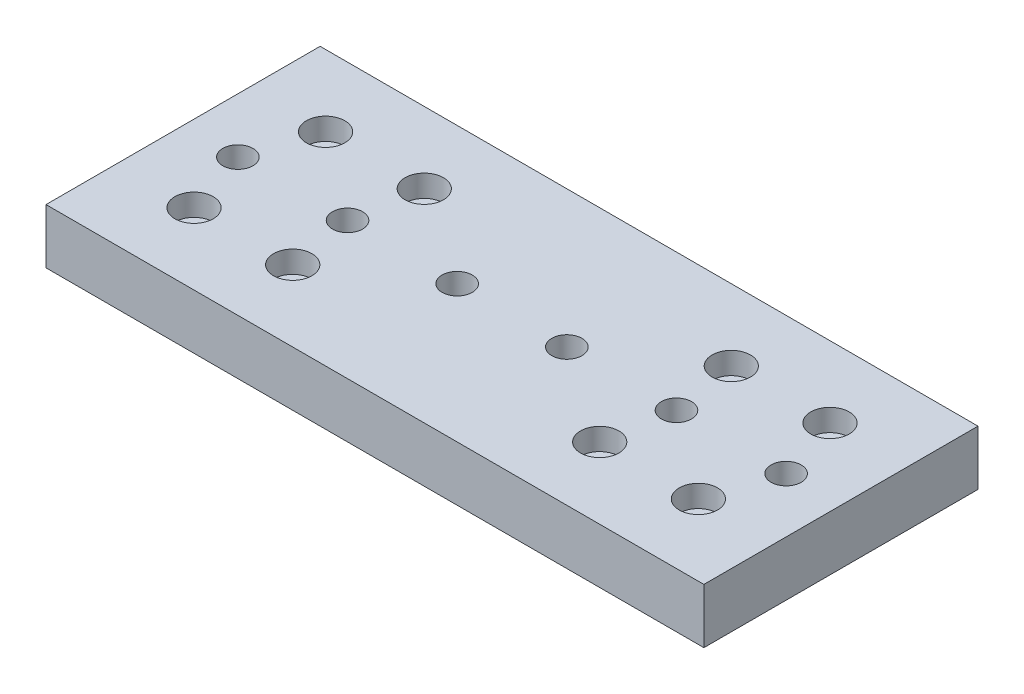
ISO-10303-21;
HEADER;
FILE_DESCRIPTION(('STEP AP214'),'2;1');
FILE_NAME('part.step','',(''),(''),'','','');
FILE_SCHEMA(('AUTOMOTIVE_DESIGN { 1 0 10303 214 1 1 1 1 }'));
ENDSEC;
DATA;
#1=APPLICATION_CONTEXT('core data for automotive mechanical design processes');
#2=APPLICATION_PROTOCOL_DEFINITION('international standard','automotive_design',2000,#1);
#3=PRODUCT_CONTEXT('',#1,'mechanical');
#4=PRODUCT('Part','Part','',(#3));
#5=PRODUCT_RELATED_PRODUCT_CATEGORY('part','',(#4));
#6=PRODUCT_DEFINITION_FORMATION('','',#4);
#7=PRODUCT_DEFINITION_CONTEXT('part definition',#1,'design');
#8=PRODUCT_DEFINITION('design','',#6,#7);
#9=PRODUCT_DEFINITION_SHAPE('','',#8);
#10=(LENGTH_UNIT() NAMED_UNIT(*) SI_UNIT(.MILLI.,.METRE.));
#11=(NAMED_UNIT(*) PLANE_ANGLE_UNIT() SI_UNIT($,.RADIAN.));
#12=(NAMED_UNIT(*) SI_UNIT($,.STERADIAN.) SOLID_ANGLE_UNIT());
#13=UNCERTAINTY_MEASURE_WITH_UNIT(LENGTH_MEASURE(1.E-05),#10,'distance_accuracy_value','');
#14=(GEOMETRIC_REPRESENTATION_CONTEXT(3) GLOBAL_UNCERTAINTY_ASSIGNED_CONTEXT((#13)) GLOBAL_UNIT_ASSIGNED_CONTEXT((#10,
#11,#12)) REPRESENTATION_CONTEXT('',''));
#15=CARTESIAN_POINT('',(0.,0.,0.));
#16=DIRECTION('',(0.,0.,1.));
#17=DIRECTION('',(1.,0.,0.));
#18=AXIS2_PLACEMENT_3D('',#15,#16,#17);
#19=CARTESIAN_POINT('',(0.,0.,0.));
#20=DIRECTION('',(0.,1.,0.));
#21=DIRECTION('',(0.,0.,1.));
#22=AXIS2_PLACEMENT_3D('',#19,#20,#21);
#23=PLANE('',#22);
#24=CARTESIAN_POINT('',(50.,0.,0.));
#25=DIRECTION('',(0.,-1.,0.));
#26=DIRECTION('',(0.,0.,-1.));
#27=AXIS2_PLACEMENT_3D('',#24,#25,#26);
#28=CIRCLE('',#27,5.735);
#29=CARTESIAN_POINT('',(50.,0.,-5.735));
#30=VERTEX_POINT('',#29);
#31=EDGE_CURVE('E471',#30,#30,#28,.T.);
#32=ORIENTED_EDGE('',*,*,#31,.F.);
#33=EDGE_LOOP('',(#32));
#34=FACE_BOUND('',#33,.T.);
#35=CARTESIAN_POINT('',(30.,0.,0.));
#36=DIRECTION('',(0.,-1.,0.));
#37=DIRECTION('',(0.,0.,-1.));
#38=AXIS2_PLACEMENT_3D('',#35,#36,#37);
#39=CIRCLE('',#38,5.735);
#40=CARTESIAN_POINT('',(30.,0.,-5.735));
#41=VERTEX_POINT('',#40);
#42=EDGE_CURVE('E478',#41,#41,#39,.T.);
#43=ORIENTED_EDGE('',*,*,#42,.F.);
#44=EDGE_LOOP('',(#43));
#45=FACE_BOUND('',#44,.T.);
#46=CARTESIAN_POINT('',(9.99999999999999,0.,0.));
#47=DIRECTION('',(0.,-1.,0.));
#48=DIRECTION('',(0.,0.,-1.));
#49=AXIS2_PLACEMENT_3D('',#46,#47,#48);
#50=CIRCLE('',#49,5.735);
#51=CARTESIAN_POINT('',(9.99999999999999,0.,-5.735));
#52=VERTEX_POINT('',#51);
#53=EDGE_CURVE('E487',#52,#52,#50,.T.);
#54=ORIENTED_EDGE('',*,*,#53,.F.);
#55=EDGE_LOOP('',(#54));
#56=FACE_BOUND('',#55,.T.);
#57=CARTESIAN_POINT('',(-10.,0.,0.));
#58=DIRECTION('',(0.,-1.,0.));
#59=DIRECTION('',(0.,0.,-1.));
#60=AXIS2_PLACEMENT_3D('',#57,#58,#59);
#61=CIRCLE('',#60,5.735);
#62=CARTESIAN_POINT('',(-10.,0.,-5.735));
#63=VERTEX_POINT('',#62);
#64=EDGE_CURVE('E496',#63,#63,#61,.T.);
#65=ORIENTED_EDGE('',*,*,#64,.F.);
#66=EDGE_LOOP('',(#65));
#67=FACE_BOUND('',#66,.T.);
#68=CARTESIAN_POINT('',(-30.,0.,0.));
#69=DIRECTION('',(0.,-1.,0.));
#70=DIRECTION('',(0.,0.,-1.));
#71=AXIS2_PLACEMENT_3D('',#68,#69,#70);
#72=CIRCLE('',#71,5.735);
#73=CARTESIAN_POINT('',(-30.,0.,-5.735));
#74=VERTEX_POINT('',#73);
#75=EDGE_CURVE('E505',#74,#74,#72,.T.);
#76=ORIENTED_EDGE('',*,*,#75,.F.);
#77=EDGE_LOOP('',(#76));
#78=FACE_BOUND('',#77,.T.);
#79=DIRECTION('',(0.,0.,1.));
#80=VECTOR('',#79,1.);
#81=CARTESIAN_POINT('',(-60.,0.,25.));
#82=LINE('',#81,#80);
#83=CARTESIAN_POINT('',(-60.,0.,-25.));
#84=VERTEX_POINT('',#83);
#85=CARTESIAN_POINT('',(-60.,0.,25.));
#86=VERTEX_POINT('',#85);
#87=EDGE_CURVE('E105',#84,#86,#82,.T.);
#88=ORIENTED_EDGE('',*,*,#87,.F.);
#89=DIRECTION('',(-1.,0.,0.));
#90=VECTOR('',#89,1.);
#91=CARTESIAN_POINT('',(60.,0.,-25.));
#92=LINE('',#91,#90);
#93=CARTESIAN_POINT('',(60.,0.,-25.));
#94=VERTEX_POINT('',#93);
#95=EDGE_CURVE('E80',#94,#84,#92,.T.);
#96=ORIENTED_EDGE('',*,*,#95,.F.);
#97=DIRECTION('',(0.,0.,-1.));
#98=VECTOR('',#97,1.);
#99=CARTESIAN_POINT('',(60.,0.,25.));
#100=LINE('',#99,#98);
#101=CARTESIAN_POINT('',(60.,0.,25.));
#102=VERTEX_POINT('',#101);
#103=EDGE_CURVE('E74',#102,#94,#100,.T.);
#104=ORIENTED_EDGE('',*,*,#103,.F.);
#105=DIRECTION('',(1.,0.,0.));
#106=VECTOR('',#105,1.);
#107=CARTESIAN_POINT('',(60.,0.,25.));
#108=LINE('',#107,#106);
#109=EDGE_CURVE('E96',#86,#102,#108,.T.);
#110=ORIENTED_EDGE('',*,*,#109,.F.);
#111=EDGE_LOOP('',(#88,#96,#104,#110));
#112=FACE_BOUND('',#111,.T.);
#113=CARTESIAN_POINT('',(-27.9999999999994,0.,11.9999999999998));
#114=DIRECTION('',(0.,1.,0.));
#115=DIRECTION('',(0.,0.,-1.));
#116=AXIS2_PLACEMENT_3D('',#113,#114,#115);
#117=CIRCLE('',#116,1.5);
#118=CARTESIAN_POINT('',(-27.9999999999994,0.,10.4999999999998));
#119=VERTEX_POINT('',#118);
#120=EDGE_CURVE('E108',#119,#119,#117,.T.);
#121=ORIENTED_EDGE('',*,*,#120,.T.);
#122=EDGE_LOOP('',(#121));
#123=FACE_BOUND('',#122,.T.);
#124=CARTESIAN_POINT('',(-45.9999999999994,0.,-11.9999999999998));
#125=DIRECTION('',(0.,1.,0.));
#126=DIRECTION('',(0.,0.,1.));
#127=AXIS2_PLACEMENT_3D('',#124,#125,#126);
#128=CIRCLE('',#127,1.5);
#129=CARTESIAN_POINT('',(-45.9999999999994,0.,-10.4999999999998));
#130=VERTEX_POINT('',#129);
#131=EDGE_CURVE('E146',#130,#130,#128,.T.);
#132=ORIENTED_EDGE('',*,*,#131,.T.);
#133=EDGE_LOOP('',(#132));
#134=FACE_BOUND('',#133,.T.);
#135=CARTESIAN_POINT('',(27.9999999999994,0.,-11.9999999999998));
#136=DIRECTION('',(0.,1.,0.));
#137=DIRECTION('',(0.,0.,-1.));
#138=AXIS2_PLACEMENT_3D('',#135,#136,#137);
#139=CIRCLE('',#138,1.5);
#140=CARTESIAN_POINT('',(27.9999999999994,0.,-13.4999999999998));
#141=VERTEX_POINT('',#140);
#142=EDGE_CURVE('E141',#141,#141,#139,.T.);
#143=ORIENTED_EDGE('',*,*,#142,.T.);
#144=EDGE_LOOP('',(#143));
#145=FACE_BOUND('',#144,.T.);
#146=CARTESIAN_POINT('',(-27.9999999999994,0.,-11.9999999999998));
#147=DIRECTION('',(0.,1.,0.));
#148=DIRECTION('',(0.,0.,1.));
#149=AXIS2_PLACEMENT_3D('',#146,#147,#148);
#150=CIRCLE('',#149,1.5);
#151=CARTESIAN_POINT('',(-27.9999999999994,0.,-10.4999999999998));
#152=VERTEX_POINT('',#151);
#153=EDGE_CURVE('E137',#152,#152,#150,.T.);
#154=ORIENTED_EDGE('',*,*,#153,.T.);
#155=EDGE_LOOP('',(#154));
#156=FACE_BOUND('',#155,.T.);
#157=CARTESIAN_POINT('',(45.9999999999994,0.,-11.9999999999997));
#158=DIRECTION('',(0.,1.,0.));
#159=DIRECTION('',(0.,0.,-1.));
#160=AXIS2_PLACEMENT_3D('',#157,#158,#159);
#161=CIRCLE('',#160,1.50000000000001);
#162=CARTESIAN_POINT('',(45.9999999999994,0.,-13.4999999999997));
#163=VERTEX_POINT('',#162);
#164=EDGE_CURVE('E153',#163,#163,#161,.T.);
#165=ORIENTED_EDGE('',*,*,#164,.T.);
#166=EDGE_LOOP('',(#165));
#167=FACE_BOUND('',#166,.T.);
#168=CARTESIAN_POINT('',(45.9999999999994,0.,11.9999999999999));
#169=DIRECTION('',(0.,1.,0.));
#170=DIRECTION('',(0.,0.,1.));
#171=AXIS2_PLACEMENT_3D('',#168,#169,#170);
#172=CIRCLE('',#171,1.5);
#173=CARTESIAN_POINT('',(45.9999999999994,0.,13.4999999999998));
#174=VERTEX_POINT('',#173);
#175=EDGE_CURVE('E161',#174,#174,#172,.T.);
#176=ORIENTED_EDGE('',*,*,#175,.T.);
#177=EDGE_LOOP('',(#176));
#178=FACE_BOUND('',#177,.T.);
#179=CARTESIAN_POINT('',(27.9999999999994,0.,11.9999999999999));
#180=DIRECTION('',(0.,1.,0.));
#181=DIRECTION('',(0.,0.,1.));
#182=AXIS2_PLACEMENT_3D('',#179,#180,#181);
#183=CIRCLE('',#182,1.5);
#184=CARTESIAN_POINT('',(27.9999999999994,0.,13.4999999999999));
#185=VERTEX_POINT('',#184);
#186=EDGE_CURVE('E158',#185,#185,#183,.T.);
#187=ORIENTED_EDGE('',*,*,#186,.T.);
#188=EDGE_LOOP('',(#187));
#189=FACE_BOUND('',#188,.T.);
#190=CARTESIAN_POINT('',(-45.9999999999994,0.,11.9999999999998));
#191=DIRECTION('',(0.,1.,0.));
#192=DIRECTION('',(0.,0.,-1.));
#193=AXIS2_PLACEMENT_3D('',#190,#191,#192);
#194=CIRCLE('',#193,1.5);
#195=CARTESIAN_POINT('',(-45.9999999999994,0.,10.4999999999998));
#196=VERTEX_POINT('',#195);
#197=EDGE_CURVE('E155',#196,#196,#194,.T.);
#198=ORIENTED_EDGE('',*,*,#197,.T.);
#199=EDGE_LOOP('',(#198));
#200=FACE_BOUND('',#199,.T.);
#201=CARTESIAN_POINT('',(-50.,0.,0.));
#202=DIRECTION('',(0.,-1.,0.));
#203=DIRECTION('',(0.,0.,-1.));
#204=AXIS2_PLACEMENT_3D('',#201,#202,#203);
#205=CIRCLE('',#204,5.735);
#206=CARTESIAN_POINT('',(-50.,0.,-5.735));
#207=VERTEX_POINT('',#206);
#208=EDGE_CURVE('E244',#207,#207,#205,.T.);
#209=ORIENTED_EDGE('',*,*,#208,.F.);
#210=EDGE_LOOP('',(#209));
#211=FACE_BOUND('',#210,.T.);
#212=ADVANCED_FACE('F38',(#34,#45,#56,#67,#78,#112,#123,#134,#145,#156,#167,#178,#189,#200,
#211),#23,.F.);
#213=CARTESIAN_POINT('',(-45.9999999999994,0.,-11.9999999999998));
#214=DIRECTION('',(0.,1.,0.));
#215=DIRECTION('',(0.,0.,1.));
#216=AXIS2_PLACEMENT_3D('',#213,#214,#215);
#217=CYLINDRICAL_SURFACE('',#216,1.5);
#218=ORIENTED_EDGE('',*,*,#131,.F.);
#219=EDGE_LOOP('',(#218));
#220=FACE_BOUND('',#219,.T.);
#221=CARTESIAN_POINT('',(-45.9999999999994,6.,-11.9999999999998));
#222=DIRECTION('',(0.,1.,0.));
#223=DIRECTION('',(0.,0.,1.));
#224=AXIS2_PLACEMENT_3D('',#221,#222,#223);
#225=CIRCLE('',#224,1.5);
#226=CARTESIAN_POINT('',(-45.9999999999994,6.,-10.4999999999998));
#227=VERTEX_POINT('',#226);
#228=EDGE_CURVE('E132',#227,#227,#225,.F.);
#229=ORIENTED_EDGE('',*,*,#228,.F.);
#230=EDGE_LOOP('',(#229));
#231=FACE_BOUND('',#230,.T.);
#232=ADVANCED_FACE('F187',(#220,#231),#217,.F.);
#233=CARTESIAN_POINT('',(-27.9999999999994,0.,-11.9999999999998));
#234=DIRECTION('',(0.,1.,0.));
#235=DIRECTION('',(0.,0.,1.));
#236=AXIS2_PLACEMENT_3D('',#233,#234,#235);
#237=CYLINDRICAL_SURFACE('',#236,1.5);
#238=ORIENTED_EDGE('',*,*,#153,.F.);
#239=EDGE_LOOP('',(#238));
#240=FACE_BOUND('',#239,.T.);
#241=CARTESIAN_POINT('',(-27.9999999999994,6.,-11.9999999999998));
#242=DIRECTION('',(0.,1.,0.));
#243=DIRECTION('',(0.,0.,1.));
#244=AXIS2_PLACEMENT_3D('',#241,#242,#243);
#245=CIRCLE('',#244,1.5);
#246=CARTESIAN_POINT('',(-27.9999999999994,6.,-10.4999999999998));
#247=VERTEX_POINT('',#246);
#248=EDGE_CURVE('E127',#247,#247,#245,.F.);
#249=ORIENTED_EDGE('',*,*,#248,.F.);
#250=EDGE_LOOP('',(#249));
#251=FACE_BOUND('',#250,.T.);
#252=ADVANCED_FACE('F193',(#240,#251),#237,.F.);
#253=CARTESIAN_POINT('',(45.9999999999994,0.,11.9999999999999));
#254=DIRECTION('',(0.,1.,0.));
#255=DIRECTION('',(0.,0.,1.));
#256=AXIS2_PLACEMENT_3D('',#253,#254,#255);
#257=CYLINDRICAL_SURFACE('',#256,1.5);
#258=ORIENTED_EDGE('',*,*,#175,.F.);
#259=EDGE_LOOP('',(#258));
#260=FACE_BOUND('',#259,.T.);
#261=CARTESIAN_POINT('',(45.9999999999994,6.,11.9999999999999));
#262=DIRECTION('',(0.,1.,0.));
#263=DIRECTION('',(0.,0.,1.));
#264=AXIS2_PLACEMENT_3D('',#261,#262,#263);
#265=CIRCLE('',#264,1.5);
#266=CARTESIAN_POINT('',(45.9999999999994,6.,13.4999999999998));
#267=VERTEX_POINT('',#266);
#268=EDGE_CURVE('E121',#267,#267,#265,.F.);
#269=ORIENTED_EDGE('',*,*,#268,.F.);
#270=EDGE_LOOP('',(#269));
#271=FACE_BOUND('',#270,.T.);
#272=ADVANCED_FACE('F211',(#260,#271),#257,.F.);
#273=CARTESIAN_POINT('',(27.9999999999994,0.,11.9999999999999));
#274=DIRECTION('',(0.,1.,0.));
#275=DIRECTION('',(0.,0.,1.));
#276=AXIS2_PLACEMENT_3D('',#273,#274,#275);
#277=CYLINDRICAL_SURFACE('',#276,1.5);
#278=ORIENTED_EDGE('',*,*,#186,.F.);
#279=EDGE_LOOP('',(#278));
#280=FACE_BOUND('',#279,.T.);
#281=CARTESIAN_POINT('',(27.9999999999994,6.,11.9999999999999));
#282=DIRECTION('',(0.,1.,0.));
#283=DIRECTION('',(0.,0.,1.));
#284=AXIS2_PLACEMENT_3D('',#281,#282,#283);
#285=CIRCLE('',#284,1.5);
#286=CARTESIAN_POINT('',(27.9999999999994,6.,13.4999999999999));
#287=VERTEX_POINT('',#286);
#288=EDGE_CURVE('E117',#287,#287,#285,.F.);
#289=ORIENTED_EDGE('',*,*,#288,.F.);
#290=EDGE_LOOP('',(#289));
#291=FACE_BOUND('',#290,.T.);
#292=ADVANCED_FACE('F206',(#280,#291),#277,.F.);
#293=CARTESIAN_POINT('',(-60.,10.,25.));
#294=DIRECTION('',(1.,0.,0.));
#295=DIRECTION('',(0.,0.,-1.));
#296=AXIS2_PLACEMENT_3D('',#293,#294,#295);
#297=PLANE('',#296);
#298=ORIENTED_EDGE('',*,*,#87,.T.);
#299=DIRECTION('',(0.,-1.,0.));
#300=VECTOR('',#299,1.);
#301=CARTESIAN_POINT('',(-60.,10.,25.));
#302=LINE('',#301,#300);
#303=CARTESIAN_POINT('',(-60.,10.,25.));
#304=VERTEX_POINT('',#303);
#305=EDGE_CURVE('E11',#304,#86,#302,.T.);
#306=ORIENTED_EDGE('',*,*,#305,.F.);
#307=DIRECTION('',(0.,0.,1.));
#308=VECTOR('',#307,1.);
#309=CARTESIAN_POINT('',(-60.,10.,25.));
#310=LINE('',#309,#308);
#311=CARTESIAN_POINT('',(-60.,10.,-25.));
#312=VERTEX_POINT('',#311);
#313=EDGE_CURVE('E92',#312,#304,#310,.T.);
#314=ORIENTED_EDGE('',*,*,#313,.F.);
#315=DIRECTION('',(0.,-1.,0.));
#316=VECTOR('',#315,1.);
#317=CARTESIAN_POINT('',(-60.,10.,-25.));
#318=LINE('',#317,#316);
#319=EDGE_CURVE('E101',#312,#84,#318,.T.);
#320=ORIENTED_EDGE('',*,*,#319,.T.);
#321=EDGE_LOOP('',(#298,#306,#314,#320));
#322=FACE_BOUND('',#321,.T.);
#323=ADVANCED_FACE('F40',(#322),#297,.F.);
#324=CARTESIAN_POINT('',(60.,10.,25.));
#325=DIRECTION('',(0.,0.,-1.));
#326=DIRECTION('',(-1.,0.,0.));
#327=AXIS2_PLACEMENT_3D('',#324,#325,#326);
#328=PLANE('',#327);
#329=ORIENTED_EDGE('',*,*,#109,.T.);
#330=DIRECTION('',(0.,-1.,0.));
#331=VECTOR('',#330,1.);
#332=CARTESIAN_POINT('',(60.,10.,25.));
#333=LINE('',#332,#331);
#334=CARTESIAN_POINT('',(60.,10.,25.));
#335=VERTEX_POINT('',#334);
#336=EDGE_CURVE('E48',#335,#102,#333,.T.);
#337=ORIENTED_EDGE('',*,*,#336,.F.);
#338=DIRECTION('',(1.,0.,0.));
#339=VECTOR('',#338,1.);
#340=CARTESIAN_POINT('',(60.,10.,25.));
#341=LINE('',#340,#339);
#342=EDGE_CURVE('E87',#304,#335,#341,.T.);
#343=ORIENTED_EDGE('',*,*,#342,.F.);
#344=ORIENTED_EDGE('',*,*,#305,.T.);
#345=EDGE_LOOP('',(#329,#337,#343,#344));
#346=FACE_BOUND('',#345,.T.);
#347=ADVANCED_FACE('F95',(#346),#328,.F.);
#348=CARTESIAN_POINT('',(60.,10.,25.));
#349=DIRECTION('',(-1.,0.,0.));
#350=DIRECTION('',(0.,0.,1.));
#351=AXIS2_PLACEMENT_3D('',#348,#349,#350);
#352=PLANE('',#351);
#353=ORIENTED_EDGE('',*,*,#103,.T.);
#354=DIRECTION('',(0.,-1.,0.));
#355=VECTOR('',#354,1.);
#356=CARTESIAN_POINT('',(60.,10.,-25.));
#357=LINE('',#356,#355);
#358=CARTESIAN_POINT('',(60.,10.,-25.));
#359=VERTEX_POINT('',#358);
#360=EDGE_CURVE('E97',#359,#94,#357,.T.);
#361=ORIENTED_EDGE('',*,*,#360,.F.);
#362=DIRECTION('',(0.,0.,-1.));
#363=VECTOR('',#362,1.);
#364=CARTESIAN_POINT('',(60.,10.,25.));
#365=LINE('',#364,#363);
#366=EDGE_CURVE('E90',#335,#359,#365,.T.);
#367=ORIENTED_EDGE('',*,*,#366,.F.);
#368=ORIENTED_EDGE('',*,*,#336,.T.);
#369=EDGE_LOOP('',(#353,#361,#367,#368));
#370=FACE_BOUND('',#369,.T.);
#371=ADVANCED_FACE('F99',(#370),#352,.F.);
#372=CARTESIAN_POINT('',(60.,10.,-25.));
#373=DIRECTION('',(0.,0.,1.));
#374=DIRECTION('',(1.,0.,0.));
#375=AXIS2_PLACEMENT_3D('',#372,#373,#374);
#376=PLANE('',#375);
#377=ORIENTED_EDGE('',*,*,#95,.T.);
#378=ORIENTED_EDGE('',*,*,#319,.F.);
#379=DIRECTION('',(-1.,0.,0.));
#380=VECTOR('',#379,1.);
#381=CARTESIAN_POINT('',(60.,10.,-25.));
#382=LINE('',#381,#380);
#383=EDGE_CURVE('E57',#359,#312,#382,.T.);
#384=ORIENTED_EDGE('',*,*,#383,.F.);
#385=ORIENTED_EDGE('',*,*,#360,.T.);
#386=EDGE_LOOP('',(#377,#378,#384,#385));
#387=FACE_BOUND('',#386,.T.);
#388=ADVANCED_FACE('F182',(#387),#376,.F.);
#389=CARTESIAN_POINT('',(0.,10.,0.));
#390=DIRECTION('',(0.,1.,0.));
#391=DIRECTION('',(0.,0.,1.));
#392=AXIS2_PLACEMENT_3D('',#389,#390,#391);
#393=PLANE('',#392);
#394=CARTESIAN_POINT('',(50.,10.,0.));
#395=DIRECTION('',(0.,-1.,0.));
#396=DIRECTION('',(0.,0.,-1.));
#397=AXIS2_PLACEMENT_3D('',#394,#395,#396);
#398=CIRCLE('',#397,2.75);
#399=CARTESIAN_POINT('',(50.,10.,-2.75));
#400=VERTEX_POINT('',#399);
#401=EDGE_CURVE('E473',#400,#400,#398,.T.);
#402=ORIENTED_EDGE('',*,*,#401,.T.);
#403=EDGE_LOOP('',(#402));
#404=FACE_BOUND('',#403,.T.);
#405=CARTESIAN_POINT('',(30.,10.,0.));
#406=DIRECTION('',(0.,-1.,0.));
#407=DIRECTION('',(0.,0.,-1.));
#408=AXIS2_PLACEMENT_3D('',#405,#406,#407);
#409=CIRCLE('',#408,2.75);
#410=CARTESIAN_POINT('',(30.,10.,-2.75));
#411=VERTEX_POINT('',#410);
#412=EDGE_CURVE('E484',#411,#411,#409,.T.);
#413=ORIENTED_EDGE('',*,*,#412,.T.);
#414=EDGE_LOOP('',(#413));
#415=FACE_BOUND('',#414,.T.);
#416=CARTESIAN_POINT('',(9.99999999999999,10.,0.));
#417=DIRECTION('',(0.,-1.,0.));
#418=DIRECTION('',(0.,0.,-1.));
#419=AXIS2_PLACEMENT_3D('',#416,#417,#418);
#420=CIRCLE('',#419,2.75);
#421=CARTESIAN_POINT('',(9.99999999999999,10.,-2.75));
#422=VERTEX_POINT('',#421);
#423=EDGE_CURVE('E493',#422,#422,#420,.T.);
#424=ORIENTED_EDGE('',*,*,#423,.T.);
#425=EDGE_LOOP('',(#424));
#426=FACE_BOUND('',#425,.T.);
#427=CARTESIAN_POINT('',(-10.,10.,0.));
#428=DIRECTION('',(0.,-1.,0.));
#429=DIRECTION('',(0.,0.,-1.));
#430=AXIS2_PLACEMENT_3D('',#427,#428,#429);
#431=CIRCLE('',#430,2.75);
#432=CARTESIAN_POINT('',(-10.,10.,-2.75));
#433=VERTEX_POINT('',#432);
#434=EDGE_CURVE('E502',#433,#433,#431,.T.);
#435=ORIENTED_EDGE('',*,*,#434,.T.);
#436=EDGE_LOOP('',(#435));
#437=FACE_BOUND('',#436,.T.);
#438=CARTESIAN_POINT('',(-30.,10.,0.));
#439=DIRECTION('',(0.,-1.,0.));
#440=DIRECTION('',(0.,0.,-1.));
#441=AXIS2_PLACEMENT_3D('',#438,#439,#440);
#442=CIRCLE('',#441,2.75);
#443=CARTESIAN_POINT('',(-30.,10.,-2.75));
#444=VERTEX_POINT('',#443);
#445=EDGE_CURVE('E247',#444,#444,#442,.T.);
#446=ORIENTED_EDGE('',*,*,#445,.T.);
#447=EDGE_LOOP('',(#446));
#448=FACE_BOUND('',#447,.T.);
#449=CARTESIAN_POINT('',(-50.,10.,0.));
#450=DIRECTION('',(0.,-1.,0.));
#451=DIRECTION('',(0.,0.,-1.));
#452=AXIS2_PLACEMENT_3D('',#449,#450,#451);
#453=CIRCLE('',#452,2.75);
#454=CARTESIAN_POINT('',(-50.,10.,-2.75));
#455=VERTEX_POINT('',#454);
#456=EDGE_CURVE('E250',#455,#455,#453,.T.);
#457=ORIENTED_EDGE('',*,*,#456,.T.);
#458=EDGE_LOOP('',(#457));
#459=FACE_BOUND('',#458,.T.);
#460=CARTESIAN_POINT('',(45.9999999999994,10.,11.9999999999999));
#461=DIRECTION('',(0.,1.,0.));
#462=DIRECTION('',(0.,0.,1.));
#463=AXIS2_PLACEMENT_3D('',#460,#461,#462);
#464=CIRCLE('',#463,3.50000000000001);
#465=CARTESIAN_POINT('',(45.9999999999994,10.,15.4999999999999));
#466=VERTEX_POINT('',#465);
#467=EDGE_CURVE('E263',#466,#466,#464,.T.);
#468=ORIENTED_EDGE('',*,*,#467,.F.);
#469=EDGE_LOOP('',(#468));
#470=FACE_BOUND('',#469,.T.);
#471=CARTESIAN_POINT('',(-45.9999999999994,10.,11.9999999999998));
#472=DIRECTION('',(0.,1.,0.));
#473=DIRECTION('',(0.,0.,-1.));
#474=AXIS2_PLACEMENT_3D('',#471,#472,#473);
#475=CIRCLE('',#474,3.5);
#476=CARTESIAN_POINT('',(-45.9999999999994,10.,8.49999999999978));
#477=VERTEX_POINT('',#476);
#478=EDGE_CURVE('E282',#477,#477,#475,.T.);
#479=ORIENTED_EDGE('',*,*,#478,.F.);
#480=EDGE_LOOP('',(#479));
#481=FACE_BOUND('',#480,.T.);
#482=CARTESIAN_POINT('',(-27.9999999999994,10.,11.9999999999998));
#483=DIRECTION('',(0.,1.,0.));
#484=DIRECTION('',(0.,0.,-1.));
#485=AXIS2_PLACEMENT_3D('',#482,#483,#484);
#486=CIRCLE('',#485,3.5);
#487=CARTESIAN_POINT('',(-27.9999999999994,10.,8.49999999999984));
#488=VERTEX_POINT('',#487);
#489=EDGE_CURVE('E281',#488,#488,#486,.T.);
#490=ORIENTED_EDGE('',*,*,#489,.F.);
#491=EDGE_LOOP('',(#490));
#492=FACE_BOUND('',#491,.T.);
#493=CARTESIAN_POINT('',(-27.9999999999994,10.,-11.9999999999998));
#494=DIRECTION('',(0.,1.,0.));
#495=DIRECTION('',(0.,0.,1.));
#496=AXIS2_PLACEMENT_3D('',#493,#494,#495);
#497=CIRCLE('',#496,3.5);
#498=CARTESIAN_POINT('',(-27.9999999999994,10.,-8.49999999999983));
#499=VERTEX_POINT('',#498);
#500=EDGE_CURVE('E293',#499,#499,#497,.T.);
#501=ORIENTED_EDGE('',*,*,#500,.F.);
#502=EDGE_LOOP('',(#501));
#503=FACE_BOUND('',#502,.T.);
#504=CARTESIAN_POINT('',(27.9999999999994,10.,11.9999999999999));
#505=DIRECTION('',(0.,1.,0.));
#506=DIRECTION('',(0.,0.,1.));
#507=AXIS2_PLACEMENT_3D('',#504,#505,#506);
#508=CIRCLE('',#507,3.5);
#509=CARTESIAN_POINT('',(27.9999999999994,10.,15.4999999999999));
#510=VERTEX_POINT('',#509);
#511=EDGE_CURVE('E264',#510,#510,#508,.T.);
#512=ORIENTED_EDGE('',*,*,#511,.F.);
#513=EDGE_LOOP('',(#512));
#514=FACE_BOUND('',#513,.T.);
#515=CARTESIAN_POINT('',(27.9999999999994,10.,-11.9999999999998));
#516=DIRECTION('',(0.,1.,0.));
#517=DIRECTION('',(0.,0.,-1.));
#518=AXIS2_PLACEMENT_3D('',#515,#516,#517);
#519=CIRCLE('',#518,3.5);
#520=CARTESIAN_POINT('',(27.9999999999994,10.,-15.4999999999998));
#521=VERTEX_POINT('',#520);
#522=EDGE_CURVE('E270',#521,#521,#519,.T.);
#523=ORIENTED_EDGE('',*,*,#522,.F.);
#524=EDGE_LOOP('',(#523));
#525=FACE_BOUND('',#524,.T.);
#526=CARTESIAN_POINT('',(45.9999999999994,10.,-11.9999999999997));
#527=DIRECTION('',(0.,1.,0.));
#528=DIRECTION('',(0.,0.,-1.));
#529=AXIS2_PLACEMENT_3D('',#526,#527,#528);
#530=CIRCLE('',#529,3.49999999999999);
#531=CARTESIAN_POINT('',(45.9999999999994,10.,-15.4999999999997));
#532=VERTEX_POINT('',#531);
#533=EDGE_CURVE('E259',#532,#532,#530,.T.);
#534=ORIENTED_EDGE('',*,*,#533,.F.);
#535=EDGE_LOOP('',(#534));
#536=FACE_BOUND('',#535,.T.);
#537=CARTESIAN_POINT('',(-45.9999999999994,10.,-11.9999999999998));
#538=DIRECTION('',(0.,1.,0.));
#539=DIRECTION('',(0.,0.,1.));
#540=AXIS2_PLACEMENT_3D('',#537,#538,#539);
#541=CIRCLE('',#540,3.5);
#542=CARTESIAN_POINT('',(-45.9999999999994,10.,-8.49999999999977));
#543=VERTEX_POINT('',#542);
#544=EDGE_CURVE('E150',#543,#543,#541,.T.);
#545=ORIENTED_EDGE('',*,*,#544,.F.);
#546=EDGE_LOOP('',(#545));
#547=FACE_BOUND('',#546,.T.);
#548=ORIENTED_EDGE('',*,*,#313,.T.);
#549=ORIENTED_EDGE('',*,*,#342,.T.);
#550=ORIENTED_EDGE('',*,*,#366,.T.);
#551=ORIENTED_EDGE('',*,*,#383,.T.);
#552=EDGE_LOOP('',(#548,#549,#550,#551));
#553=FACE_BOUND('',#552,.T.);
#554=ADVANCED_FACE('F88',(#404,#415,#426,#437,#448,#459,#470,#481,#492,#503,#514,#525,#536,#547,
#553),#393,.T.);
#555=CARTESIAN_POINT('',(-27.9999999999994,0.,11.9999999999998));
#556=DIRECTION('',(0.,1.,0.));
#557=DIRECTION('',(0.,0.,1.));
#558=AXIS2_PLACEMENT_3D('',#555,#556,#557);
#559=CYLINDRICAL_SURFACE('',#558,1.5);
#560=CARTESIAN_POINT('',(-27.9999999999994,6.,11.9999999999998));
#561=DIRECTION('',(0.,-1.,0.));
#562=DIRECTION('',(0.,0.,-1.));
#563=AXIS2_PLACEMENT_3D('',#560,#561,#562);
#564=CIRCLE('',#563,1.5);
#565=CARTESIAN_POINT('',(-27.9999999999994,6.,10.4999999999998));
#566=VERTEX_POINT('',#565);
#567=EDGE_CURVE('E42',#566,#566,#564,.F.);
#568=ORIENTED_EDGE('',*,*,#567,.T.);
#569=EDGE_LOOP('',(#568));
#570=FACE_BOUND('',#569,.T.);
#571=ORIENTED_EDGE('',*,*,#120,.F.);
#572=EDGE_LOOP('',(#571));
#573=FACE_BOUND('',#572,.T.);
#574=ADVANCED_FACE('F171',(#570,#573),#559,.F.);
#575=CARTESIAN_POINT('',(27.9999999999994,0.,-11.9999999999998));
#576=DIRECTION('',(0.,1.,0.));
#577=DIRECTION('',(0.,0.,1.));
#578=AXIS2_PLACEMENT_3D('',#575,#576,#577);
#579=CYLINDRICAL_SURFACE('',#578,1.5);
#580=CARTESIAN_POINT('',(27.9999999999994,6.,-11.9999999999998));
#581=DIRECTION('',(0.,-1.,0.));
#582=DIRECTION('',(0.,0.,-1.));
#583=AXIS2_PLACEMENT_3D('',#580,#581,#582);
#584=CIRCLE('',#583,1.5);
#585=CARTESIAN_POINT('',(27.9999999999994,6.,-13.4999999999998));
#586=VERTEX_POINT('',#585);
#587=EDGE_CURVE('E130',#586,#586,#584,.F.);
#588=ORIENTED_EDGE('',*,*,#587,.T.);
#589=EDGE_LOOP('',(#588));
#590=FACE_BOUND('',#589,.T.);
#591=ORIENTED_EDGE('',*,*,#142,.F.);
#592=EDGE_LOOP('',(#591));
#593=FACE_BOUND('',#592,.T.);
#594=ADVANCED_FACE('F173',(#590,#593),#579,.F.);
#595=CARTESIAN_POINT('',(45.9999999999994,0.,-11.9999999999997));
#596=DIRECTION('',(0.,1.,0.));
#597=DIRECTION('',(0.,0.,1.));
#598=AXIS2_PLACEMENT_3D('',#595,#596,#597);
#599=CYLINDRICAL_SURFACE('',#598,1.50000000000001);
#600=CARTESIAN_POINT('',(45.9999999999994,6.,-11.9999999999997));
#601=DIRECTION('',(0.,-1.,0.));
#602=DIRECTION('',(0.,0.,-1.));
#603=AXIS2_PLACEMENT_3D('',#600,#601,#602);
#604=CIRCLE('',#603,1.50000000000001);
#605=CARTESIAN_POINT('',(45.9999999999994,6.,-13.4999999999997));
#606=VERTEX_POINT('',#605);
#607=EDGE_CURVE('E124',#606,#606,#604,.F.);
#608=ORIENTED_EDGE('',*,*,#607,.T.);
#609=EDGE_LOOP('',(#608));
#610=FACE_BOUND('',#609,.T.);
#611=ORIENTED_EDGE('',*,*,#164,.F.);
#612=EDGE_LOOP('',(#611));
#613=FACE_BOUND('',#612,.T.);
#614=ADVANCED_FACE('F179',(#610,#613),#599,.F.);
#615=CARTESIAN_POINT('',(-45.9999999999994,0.,11.9999999999998));
#616=DIRECTION('',(0.,1.,0.));
#617=DIRECTION('',(0.,0.,1.));
#618=AXIS2_PLACEMENT_3D('',#615,#616,#617);
#619=CYLINDRICAL_SURFACE('',#618,1.5);
#620=CARTESIAN_POINT('',(-45.9999999999994,6.,11.9999999999998));
#621=DIRECTION('',(0.,-1.,0.));
#622=DIRECTION('',(0.,0.,-1.));
#623=AXIS2_PLACEMENT_3D('',#620,#621,#622);
#624=CIRCLE('',#623,1.5);
#625=CARTESIAN_POINT('',(-45.9999999999994,6.,10.4999999999998));
#626=VERTEX_POINT('',#625);
#627=EDGE_CURVE('E114',#626,#626,#624,.F.);
#628=ORIENTED_EDGE('',*,*,#627,.T.);
#629=EDGE_LOOP('',(#628));
#630=FACE_BOUND('',#629,.T.);
#631=ORIENTED_EDGE('',*,*,#197,.F.);
#632=EDGE_LOOP('',(#631));
#633=FACE_BOUND('',#632,.T.);
#634=ADVANCED_FACE('F224',(#630,#633),#619,.F.);
#635=CARTESIAN_POINT('',(-45.9999999999994,6.,11.9999999999998));
#636=DIRECTION('',(0.,-1.,0.));
#637=DIRECTION('',(0.,0.,-1.));
#638=AXIS2_PLACEMENT_3D('',#635,#636,#637);
#639=PLANE('',#638);
#640=CARTESIAN_POINT('',(-45.9999999999994,6.,11.9999999999998));
#641=DIRECTION('',(0.,1.,0.));
#642=DIRECTION('',(0.,0.,-1.));
#643=AXIS2_PLACEMENT_3D('',#640,#641,#642);
#644=CIRCLE('',#643,3.5);
#645=CARTESIAN_POINT('',(-45.9999999999994,6.,8.49999999999978));
#646=VERTEX_POINT('',#645);
#647=EDGE_CURVE('E278',#646,#646,#644,.T.);
#648=ORIENTED_EDGE('',*,*,#647,.T.);
#649=EDGE_LOOP('',(#648));
#650=FACE_BOUND('',#649,.T.);
#651=ORIENTED_EDGE('',*,*,#627,.F.);
#652=EDGE_LOOP('',(#651));
#653=FACE_BOUND('',#652,.T.);
#654=ADVANCED_FACE('F230',(#650,#653),#639,.F.);
#655=CARTESIAN_POINT('',(-45.9999999999994,6.,11.9999999999998));
#656=DIRECTION('',(0.,1.,0.));
#657=DIRECTION('',(0.,0.,1.));
#658=AXIS2_PLACEMENT_3D('',#655,#656,#657);
#659=CYLINDRICAL_SURFACE('',#658,3.5);
#660=ORIENTED_EDGE('',*,*,#647,.F.);
#661=EDGE_LOOP('',(#660));
#662=FACE_BOUND('',#661,.T.);
#663=ORIENTED_EDGE('',*,*,#478,.T.);
#664=EDGE_LOOP('',(#663));
#665=FACE_BOUND('',#664,.T.);
#666=ADVANCED_FACE('F389',(#662,#665),#659,.F.);
#667=CARTESIAN_POINT('',(27.9999999999994,6.,11.9999999999999));
#668=DIRECTION('',(0.,1.,0.));
#669=DIRECTION('',(0.,0.,1.));
#670=AXIS2_PLACEMENT_3D('',#667,#668,#669);
#671=PLANE('',#670);
#672=CARTESIAN_POINT('',(27.9999999999994,6.,11.9999999999999));
#673=DIRECTION('',(0.,1.,0.));
#674=DIRECTION('',(0.,0.,1.));
#675=AXIS2_PLACEMENT_3D('',#672,#673,#674);
#676=CIRCLE('',#675,3.5);
#677=CARTESIAN_POINT('',(27.9999999999994,6.,15.4999999999999));
#678=VERTEX_POINT('',#677);
#679=EDGE_CURVE('E260',#678,#678,#676,.T.);
#680=ORIENTED_EDGE('',*,*,#679,.T.);
#681=EDGE_LOOP('',(#680));
#682=FACE_BOUND('',#681,.T.);
#683=ORIENTED_EDGE('',*,*,#288,.T.);
#684=EDGE_LOOP('',(#683));
#685=FACE_BOUND('',#684,.T.);
#686=ADVANCED_FACE('F392',(#682,#685),#671,.T.);
#687=CARTESIAN_POINT('',(27.9999999999994,6.,11.9999999999999));
#688=DIRECTION('',(0.,1.,0.));
#689=DIRECTION('',(0.,0.,1.));
#690=AXIS2_PLACEMENT_3D('',#687,#688,#689);
#691=CYLINDRICAL_SURFACE('',#690,3.5);
#692=ORIENTED_EDGE('',*,*,#679,.F.);
#693=EDGE_LOOP('',(#692));
#694=FACE_BOUND('',#693,.T.);
#695=ORIENTED_EDGE('',*,*,#511,.T.);
#696=EDGE_LOOP('',(#695));
#697=FACE_BOUND('',#696,.T.);
#698=ADVANCED_FACE('F396',(#694,#697),#691,.F.);
#699=CARTESIAN_POINT('',(45.9999999999994,6.,11.9999999999999));
#700=DIRECTION('',(0.,1.,0.));
#701=DIRECTION('',(0.,0.,1.));
#702=AXIS2_PLACEMENT_3D('',#699,#700,#701);
#703=PLANE('',#702);
#704=CARTESIAN_POINT('',(45.9999999999994,6.,11.9999999999999));
#705=DIRECTION('',(0.,1.,0.));
#706=DIRECTION('',(0.,0.,1.));
#707=AXIS2_PLACEMENT_3D('',#704,#705,#706);
#708=CIRCLE('',#707,3.50000000000001);
#709=CARTESIAN_POINT('',(45.9999999999994,6.,15.4999999999999));
#710=VERTEX_POINT('',#709);
#711=EDGE_CURVE('E285',#710,#710,#708,.T.);
#712=ORIENTED_EDGE('',*,*,#711,.T.);
#713=EDGE_LOOP('',(#712));
#714=FACE_BOUND('',#713,.T.);
#715=ORIENTED_EDGE('',*,*,#268,.T.);
#716=EDGE_LOOP('',(#715));
#717=FACE_BOUND('',#716,.T.);
#718=ADVANCED_FACE('F394',(#714,#717),#703,.T.);
#719=CARTESIAN_POINT('',(45.9999999999994,6.,11.9999999999999));
#720=DIRECTION('',(0.,1.,0.));
#721=DIRECTION('',(0.,0.,1.));
#722=AXIS2_PLACEMENT_3D('',#719,#720,#721);
#723=CYLINDRICAL_SURFACE('',#722,3.50000000000001);
#724=ORIENTED_EDGE('',*,*,#711,.F.);
#725=EDGE_LOOP('',(#724));
#726=FACE_BOUND('',#725,.T.);
#727=ORIENTED_EDGE('',*,*,#467,.T.);
#728=EDGE_LOOP('',(#727));
#729=FACE_BOUND('',#728,.T.);
#730=ADVANCED_FACE('F348',(#726,#729),#723,.F.);
#731=CARTESIAN_POINT('',(45.9999999999994,6.,-11.9999999999997));
#732=DIRECTION('',(0.,-1.,0.));
#733=DIRECTION('',(0.,0.,-1.));
#734=AXIS2_PLACEMENT_3D('',#731,#732,#733);
#735=PLANE('',#734);
#736=CARTESIAN_POINT('',(45.9999999999994,6.,-11.9999999999997));
#737=DIRECTION('',(0.,1.,0.));
#738=DIRECTION('',(0.,0.,-1.));
#739=AXIS2_PLACEMENT_3D('',#736,#737,#738);
#740=CIRCLE('',#739,3.49999999999999);
#741=CARTESIAN_POINT('',(45.9999999999994,6.,-15.4999999999997));
#742=VERTEX_POINT('',#741);
#743=EDGE_CURVE('E273',#742,#742,#740,.T.);
#744=ORIENTED_EDGE('',*,*,#743,.T.);
#745=EDGE_LOOP('',(#744));
#746=FACE_BOUND('',#745,.T.);
#747=ORIENTED_EDGE('',*,*,#607,.F.);
#748=EDGE_LOOP('',(#747));
#749=FACE_BOUND('',#748,.T.);
#750=ADVANCED_FACE('F344',(#746,#749),#735,.F.);
#751=CARTESIAN_POINT('',(45.9999999999994,6.,-11.9999999999997));
#752=DIRECTION('',(0.,1.,0.));
#753=DIRECTION('',(0.,0.,1.));
#754=AXIS2_PLACEMENT_3D('',#751,#752,#753);
#755=CYLINDRICAL_SURFACE('',#754,3.49999999999999);
#756=ORIENTED_EDGE('',*,*,#743,.F.);
#757=EDGE_LOOP('',(#756));
#758=FACE_BOUND('',#757,.T.);
#759=ORIENTED_EDGE('',*,*,#533,.T.);
#760=EDGE_LOOP('',(#759));
#761=FACE_BOUND('',#760,.T.);
#762=ADVANCED_FACE('F334',(#758,#761),#755,.F.);
#763=CARTESIAN_POINT('',(-27.9999999999994,6.,-11.9999999999998));
#764=DIRECTION('',(0.,1.,0.));
#765=DIRECTION('',(0.,0.,1.));
#766=AXIS2_PLACEMENT_3D('',#763,#764,#765);
#767=PLANE('',#766);
#768=CARTESIAN_POINT('',(-27.9999999999994,6.,-11.9999999999998));
#769=DIRECTION('',(0.,1.,0.));
#770=DIRECTION('',(0.,0.,1.));
#771=AXIS2_PLACEMENT_3D('',#768,#769,#770);
#772=CIRCLE('',#771,3.5);
#773=CARTESIAN_POINT('',(-27.9999999999994,6.,-8.49999999999983));
#774=VERTEX_POINT('',#773);
#775=EDGE_CURVE('E290',#774,#774,#772,.T.);
#776=ORIENTED_EDGE('',*,*,#775,.T.);
#777=EDGE_LOOP('',(#776));
#778=FACE_BOUND('',#777,.T.);
#779=ORIENTED_EDGE('',*,*,#248,.T.);
#780=EDGE_LOOP('',(#779));
#781=FACE_BOUND('',#780,.T.);
#782=ADVANCED_FACE('F331',(#778,#781),#767,.T.);
#783=CARTESIAN_POINT('',(-27.9999999999994,6.,-11.9999999999998));
#784=DIRECTION('',(0.,1.,0.));
#785=DIRECTION('',(0.,0.,1.));
#786=AXIS2_PLACEMENT_3D('',#783,#784,#785);
#787=CYLINDRICAL_SURFACE('',#786,3.5);
#788=ORIENTED_EDGE('',*,*,#775,.F.);
#789=EDGE_LOOP('',(#788));
#790=FACE_BOUND('',#789,.T.);
#791=ORIENTED_EDGE('',*,*,#500,.T.);
#792=EDGE_LOOP('',(#791));
#793=FACE_BOUND('',#792,.T.);
#794=ADVANCED_FACE('F333',(#790,#793),#787,.F.);
#795=CARTESIAN_POINT('',(27.9999999999994,6.,-11.9999999999998));
#796=DIRECTION('',(0.,-1.,0.));
#797=DIRECTION('',(0.,0.,-1.));
#798=AXIS2_PLACEMENT_3D('',#795,#796,#797);
#799=PLANE('',#798);
#800=CARTESIAN_POINT('',(27.9999999999994,6.,-11.9999999999998));
#801=DIRECTION('',(0.,1.,0.));
#802=DIRECTION('',(0.,0.,-1.));
#803=AXIS2_PLACEMENT_3D('',#800,#801,#802);
#804=CIRCLE('',#803,3.5);
#805=CARTESIAN_POINT('',(27.9999999999994,6.,-15.4999999999998));
#806=VERTEX_POINT('',#805);
#807=EDGE_CURVE('E267',#806,#806,#804,.T.);
#808=ORIENTED_EDGE('',*,*,#807,.T.);
#809=EDGE_LOOP('',(#808));
#810=FACE_BOUND('',#809,.T.);
#811=ORIENTED_EDGE('',*,*,#587,.F.);
#812=EDGE_LOOP('',(#811));
#813=FACE_BOUND('',#812,.T.);
#814=ADVANCED_FACE('F341',(#810,#813),#799,.F.);
#815=CARTESIAN_POINT('',(27.9999999999994,6.,-11.9999999999998));
#816=DIRECTION('',(0.,1.,0.));
#817=DIRECTION('',(0.,0.,1.));
#818=AXIS2_PLACEMENT_3D('',#815,#816,#817);
#819=CYLINDRICAL_SURFACE('',#818,3.5);
#820=ORIENTED_EDGE('',*,*,#807,.F.);
#821=EDGE_LOOP('',(#820));
#822=FACE_BOUND('',#821,.T.);
#823=ORIENTED_EDGE('',*,*,#522,.T.);
#824=EDGE_LOOP('',(#823));
#825=FACE_BOUND('',#824,.T.);
#826=ADVANCED_FACE('F320',(#822,#825),#819,.F.);
#827=CARTESIAN_POINT('',(-45.9999999999994,6.,-11.9999999999998));
#828=DIRECTION('',(0.,1.,0.));
#829=DIRECTION('',(0.,0.,1.));
#830=AXIS2_PLACEMENT_3D('',#827,#828,#829);
#831=PLANE('',#830);
#832=CARTESIAN_POINT('',(-45.9999999999994,6.,-11.9999999999998));
#833=DIRECTION('',(0.,1.,0.));
#834=DIRECTION('',(0.,0.,1.));
#835=AXIS2_PLACEMENT_3D('',#832,#833,#834);
#836=CIRCLE('',#835,3.5);
#837=CARTESIAN_POINT('',(-45.9999999999994,6.,-8.49999999999977));
#838=VERTEX_POINT('',#837);
#839=EDGE_CURVE('E118',#838,#838,#836,.T.);
#840=ORIENTED_EDGE('',*,*,#839,.T.);
#841=EDGE_LOOP('',(#840));
#842=FACE_BOUND('',#841,.T.);
#843=ORIENTED_EDGE('',*,*,#228,.T.);
#844=EDGE_LOOP('',(#843));
#845=FACE_BOUND('',#844,.T.);
#846=ADVANCED_FACE('F310',(#842,#845),#831,.T.);
#847=CARTESIAN_POINT('',(-45.9999999999994,6.,-11.9999999999998));
#848=DIRECTION('',(0.,1.,0.));
#849=DIRECTION('',(0.,0.,1.));
#850=AXIS2_PLACEMENT_3D('',#847,#848,#849);
#851=CYLINDRICAL_SURFACE('',#850,3.5);
#852=ORIENTED_EDGE('',*,*,#839,.F.);
#853=EDGE_LOOP('',(#852));
#854=FACE_BOUND('',#853,.T.);
#855=ORIENTED_EDGE('',*,*,#544,.T.);
#856=EDGE_LOOP('',(#855));
#857=FACE_BOUND('',#856,.T.);
#858=ADVANCED_FACE('F306',(#854,#857),#851,.F.);
#859=CARTESIAN_POINT('',(-27.9999999999994,6.,11.9999999999998));
#860=DIRECTION('',(0.,-1.,0.));
#861=DIRECTION('',(0.,0.,-1.));
#862=AXIS2_PLACEMENT_3D('',#859,#860,#861);
#863=PLANE('',#862);
#864=CARTESIAN_POINT('',(-27.9999999999994,6.,11.9999999999998));
#865=DIRECTION('',(0.,1.,0.));
#866=DIRECTION('',(0.,0.,-1.));
#867=AXIS2_PLACEMENT_3D('',#864,#865,#866);
#868=CIRCLE('',#867,3.5);
#869=CARTESIAN_POINT('',(-27.9999999999994,6.,8.49999999999984));
#870=VERTEX_POINT('',#869);
#871=EDGE_CURVE('E296',#870,#870,#868,.T.);
#872=ORIENTED_EDGE('',*,*,#871,.T.);
#873=EDGE_LOOP('',(#872));
#874=FACE_BOUND('',#873,.T.);
#875=ORIENTED_EDGE('',*,*,#567,.F.);
#876=EDGE_LOOP('',(#875));
#877=FACE_BOUND('',#876,.T.);
#878=ADVANCED_FACE('F309',(#874,#877),#863,.F.);
#879=CARTESIAN_POINT('',(-27.9999999999994,6.,11.9999999999998));
#880=DIRECTION('',(0.,1.,0.));
#881=DIRECTION('',(0.,0.,1.));
#882=AXIS2_PLACEMENT_3D('',#879,#880,#881);
#883=CYLINDRICAL_SURFACE('',#882,3.5);
#884=ORIENTED_EDGE('',*,*,#871,.F.);
#885=EDGE_LOOP('',(#884));
#886=FACE_BOUND('',#885,.T.);
#887=ORIENTED_EDGE('',*,*,#489,.T.);
#888=EDGE_LOOP('',(#887));
#889=FACE_BOUND('',#888,.T.);
#890=ADVANCED_FACE('F317',(#886,#889),#883,.F.);
#891=CARTESIAN_POINT('',(-50.,0.,0.));
#892=DIRECTION('',(0.,-1.,0.));
#893=DIRECTION('',(0.,0.,-1.));
#894=AXIS2_PLACEMENT_3D('',#891,#892,#893);
#895=CYLINDRICAL_SURFACE('',#894,2.75);
#896=ORIENTED_EDGE('',*,*,#456,.F.);
#897=EDGE_LOOP('',(#896));
#898=FACE_BOUND('',#897,.T.);
#899=CARTESIAN_POINT('',(-50.,2.985,0.));
#900=DIRECTION('',(0.,-1.,0.));
#901=DIRECTION('',(0.,0.,-1.));
#902=AXIS2_PLACEMENT_3D('',#899,#900,#901);
#903=CIRCLE('',#902,2.75);
#904=CARTESIAN_POINT('',(-50.,2.985,-2.75));
#905=VERTEX_POINT('',#904);
#906=EDGE_CURVE('E246',#905,#905,#903,.T.);
#907=ORIENTED_EDGE('',*,*,#906,.T.);
#908=EDGE_LOOP('',(#907));
#909=FACE_BOUND('',#908,.T.);
#910=ADVANCED_FACE('F351',(#898,#909),#895,.F.);
#911=CARTESIAN_POINT('',(-50.,0.,0.));
#912=DIRECTION('',(0.,-1.,0.));
#913=DIRECTION('',(0.,0.,-1.));
#914=AXIS2_PLACEMENT_3D('',#911,#912,#913);
#915=CONICAL_SURFACE('',#914,5.735,0.78539816339745);
#916=ORIENTED_EDGE('',*,*,#906,.F.);
#917=EDGE_LOOP('',(#916));
#918=FACE_BOUND('',#917,.T.);
#919=ORIENTED_EDGE('',*,*,#208,.T.);
#920=EDGE_LOOP('',(#919));
#921=FACE_BOUND('',#920,.T.);
#922=ADVANCED_FACE('F356',(#918,#921),#915,.F.);
#923=CARTESIAN_POINT('',(-30.,0.,0.));
#924=DIRECTION('',(0.,-1.,0.));
#925=DIRECTION('',(0.,0.,-1.));
#926=AXIS2_PLACEMENT_3D('',#923,#924,#925);
#927=CYLINDRICAL_SURFACE('',#926,2.75);
#928=ORIENTED_EDGE('',*,*,#445,.F.);
#929=EDGE_LOOP('',(#928));
#930=FACE_BOUND('',#929,.T.);
#931=CARTESIAN_POINT('',(-30.,2.985,0.));
#932=DIRECTION('',(0.,-1.,0.));
#933=DIRECTION('',(0.,0.,-1.));
#934=AXIS2_PLACEMENT_3D('',#931,#932,#933);
#935=CIRCLE('',#934,2.75);
#936=CARTESIAN_POINT('',(-30.,2.985,-2.75));
#937=VERTEX_POINT('',#936);
#938=EDGE_CURVE('E253',#937,#937,#935,.T.);
#939=ORIENTED_EDGE('',*,*,#938,.T.);
#940=EDGE_LOOP('',(#939));
#941=FACE_BOUND('',#940,.T.);
#942=ADVANCED_FACE('F424',(#930,#941),#927,.F.);
#943=CARTESIAN_POINT('',(-30.,0.,0.));
#944=DIRECTION('',(0.,-1.,0.));
#945=DIRECTION('',(0.,0.,-1.));
#946=AXIS2_PLACEMENT_3D('',#943,#944,#945);
#947=CONICAL_SURFACE('',#946,5.735,0.785398163397448);
#948=ORIENTED_EDGE('',*,*,#938,.F.);
#949=EDGE_LOOP('',(#948));
#950=FACE_BOUND('',#949,.T.);
#951=ORIENTED_EDGE('',*,*,#75,.T.);
#952=EDGE_LOOP('',(#951));
#953=FACE_BOUND('',#952,.T.);
#954=ADVANCED_FACE('F428',(#950,#953),#947,.F.);
#955=CARTESIAN_POINT('',(-10.,0.,0.));
#956=DIRECTION('',(0.,-1.,0.));
#957=DIRECTION('',(0.,0.,-1.));
#958=AXIS2_PLACEMENT_3D('',#955,#956,#957);
#959=CYLINDRICAL_SURFACE('',#958,2.75);
#960=ORIENTED_EDGE('',*,*,#434,.F.);
#961=EDGE_LOOP('',(#960));
#962=FACE_BOUND('',#961,.T.);
#963=CARTESIAN_POINT('',(-10.,2.985,0.));
#964=DIRECTION('',(0.,-1.,0.));
#965=DIRECTION('',(0.,0.,-1.));
#966=AXIS2_PLACEMENT_3D('',#963,#964,#965);
#967=CIRCLE('',#966,2.75);
#968=CARTESIAN_POINT('',(-10.,2.985,-2.75));
#969=VERTEX_POINT('',#968);
#970=EDGE_CURVE('E499',#969,#969,#967,.T.);
#971=ORIENTED_EDGE('',*,*,#970,.T.);
#972=EDGE_LOOP('',(#971));
#973=FACE_BOUND('',#972,.T.);
#974=ADVANCED_FACE('F432',(#962,#973),#959,.F.);
#975=CARTESIAN_POINT('',(-10.,0.,0.));
#976=DIRECTION('',(0.,-1.,0.));
#977=DIRECTION('',(0.,0.,-1.));
#978=AXIS2_PLACEMENT_3D('',#975,#976,#977);
#979=CONICAL_SURFACE('',#978,5.735,0.785398163397448);
#980=ORIENTED_EDGE('',*,*,#970,.F.);
#981=EDGE_LOOP('',(#980));
#982=FACE_BOUND('',#981,.T.);
#983=ORIENTED_EDGE('',*,*,#64,.T.);
#984=EDGE_LOOP('',(#983));
#985=FACE_BOUND('',#984,.T.);
#986=ADVANCED_FACE('F436',(#982,#985),#979,.F.);
#987=CARTESIAN_POINT('',(9.99999999999999,0.,0.));
#988=DIRECTION('',(0.,-1.,0.));
#989=DIRECTION('',(0.,0.,-1.));
#990=AXIS2_PLACEMENT_3D('',#987,#988,#989);
#991=CYLINDRICAL_SURFACE('',#990,2.75);
#992=ORIENTED_EDGE('',*,*,#423,.F.);
#993=EDGE_LOOP('',(#992));
#994=FACE_BOUND('',#993,.T.);
#995=CARTESIAN_POINT('',(9.99999999999999,2.985,0.));
#996=DIRECTION('',(0.,-1.,0.));
#997=DIRECTION('',(0.,0.,-1.));
#998=AXIS2_PLACEMENT_3D('',#995,#996,#997);
#999=CIRCLE('',#998,2.75);
#1000=CARTESIAN_POINT('',(9.99999999999999,2.985,-2.75));
#1001=VERTEX_POINT('',#1000);
#1002=EDGE_CURVE('E490',#1001,#1001,#999,.T.);
#1003=ORIENTED_EDGE('',*,*,#1002,.T.);
#1004=EDGE_LOOP('',(#1003));
#1005=FACE_BOUND('',#1004,.T.);
#1006=ADVANCED_FACE('F440',(#994,#1005),#991,.F.);
#1007=CARTESIAN_POINT('',(9.99999999999999,0.,0.));
#1008=DIRECTION('',(0.,-1.,0.));
#1009=DIRECTION('',(0.,0.,-1.));
#1010=AXIS2_PLACEMENT_3D('',#1007,#1008,#1009);
#1011=CONICAL_SURFACE('',#1010,5.735,0.785398163397448);
#1012=ORIENTED_EDGE('',*,*,#1002,.F.);
#1013=EDGE_LOOP('',(#1012));
#1014=FACE_BOUND('',#1013,.T.);
#1015=ORIENTED_EDGE('',*,*,#53,.T.);
#1016=EDGE_LOOP('',(#1015));
#1017=FACE_BOUND('',#1016,.T.);
#1018=ADVANCED_FACE('F444',(#1014,#1017),#1011,.F.);
#1019=CARTESIAN_POINT('',(30.,0.,0.));
#1020=DIRECTION('',(0.,-1.,0.));
#1021=DIRECTION('',(0.,0.,-1.));
#1022=AXIS2_PLACEMENT_3D('',#1019,#1020,#1021);
#1023=CYLINDRICAL_SURFACE('',#1022,2.75);
#1024=ORIENTED_EDGE('',*,*,#412,.F.);
#1025=EDGE_LOOP('',(#1024));
#1026=FACE_BOUND('',#1025,.T.);
#1027=CARTESIAN_POINT('',(30.,2.985,0.));
#1028=DIRECTION('',(0.,-1.,0.));
#1029=DIRECTION('',(0.,0.,-1.));
#1030=AXIS2_PLACEMENT_3D('',#1027,#1028,#1029);
#1031=CIRCLE('',#1030,2.75);
#1032=CARTESIAN_POINT('',(30.,2.985,-2.75));
#1033=VERTEX_POINT('',#1032);
#1034=EDGE_CURVE('E481',#1033,#1033,#1031,.T.);
#1035=ORIENTED_EDGE('',*,*,#1034,.T.);
#1036=EDGE_LOOP('',(#1035));
#1037=FACE_BOUND('',#1036,.T.);
#1038=ADVANCED_FACE('F448',(#1026,#1037),#1023,.F.);
#1039=CARTESIAN_POINT('',(30.,0.,0.));
#1040=DIRECTION('',(0.,-1.,0.));
#1041=DIRECTION('',(0.,0.,-1.));
#1042=AXIS2_PLACEMENT_3D('',#1039,#1040,#1041);
#1043=CONICAL_SURFACE('',#1042,5.735,0.78539816339745);
#1044=ORIENTED_EDGE('',*,*,#1034,.F.);
#1045=EDGE_LOOP('',(#1044));
#1046=FACE_BOUND('',#1045,.T.);
#1047=ORIENTED_EDGE('',*,*,#42,.T.);
#1048=EDGE_LOOP('',(#1047));
#1049=FACE_BOUND('',#1048,.T.);
#1050=ADVANCED_FACE('F452',(#1046,#1049),#1043,.F.);
#1051=CARTESIAN_POINT('',(50.,0.,0.));
#1052=DIRECTION('',(0.,-1.,0.));
#1053=DIRECTION('',(0.,0.,-1.));
#1054=AXIS2_PLACEMENT_3D('',#1051,#1052,#1053);
#1055=CYLINDRICAL_SURFACE('',#1054,2.75);
#1056=ORIENTED_EDGE('',*,*,#401,.F.);
#1057=EDGE_LOOP('',(#1056));
#1058=FACE_BOUND('',#1057,.T.);
#1059=CARTESIAN_POINT('',(50.,2.985,0.));
#1060=DIRECTION('',(0.,-1.,0.));
#1061=DIRECTION('',(0.,0.,-1.));
#1062=AXIS2_PLACEMENT_3D('',#1059,#1060,#1061);
#1063=CIRCLE('',#1062,2.75);
#1064=CARTESIAN_POINT('',(50.,2.985,-2.75));
#1065=VERTEX_POINT('',#1064);
#1066=EDGE_CURVE('E469',#1065,#1065,#1063,.T.);
#1067=ORIENTED_EDGE('',*,*,#1066,.T.);
#1068=EDGE_LOOP('',(#1067));
#1069=FACE_BOUND('',#1068,.T.);
#1070=ADVANCED_FACE('F456',(#1058,#1069),#1055,.F.);
#1071=CARTESIAN_POINT('',(50.,0.,0.));
#1072=DIRECTION('',(0.,-1.,0.));
#1073=DIRECTION('',(0.,0.,-1.));
#1074=AXIS2_PLACEMENT_3D('',#1071,#1072,#1073);
#1075=CONICAL_SURFACE('',#1074,5.735,0.78539816339745);
#1076=ORIENTED_EDGE('',*,*,#1066,.F.);
#1077=EDGE_LOOP('',(#1076));
#1078=FACE_BOUND('',#1077,.T.);
#1079=ORIENTED_EDGE('',*,*,#31,.T.);
#1080=EDGE_LOOP('',(#1079));
#1081=FACE_BOUND('',#1080,.T.);
#1082=ADVANCED_FACE('F460',(#1078,#1081),#1075,.F.);
#1083=CLOSED_SHELL('',(#212,#232,#252,#272,#292,#323,#347,#371,#388,#554,#574,#594,#614,#634,
#654,#666,#686,#698,#718,#730,#750,#762,#782,#794,#814,#826,#846,#858,#878,#890,#910,#922,#942,
#954,#974,#986,#1006,#1018,#1038,#1050,#1070,#1082));
#1084=MANIFOLD_SOLID_BREP('B2',#1083);
#1085=ADVANCED_BREP_SHAPE_REPRESENTATION('',(#18,#1084),#14);
#1086=SHAPE_DEFINITION_REPRESENTATION(#9,#1085);
ENDSEC;
END-ISO-10303-21;
